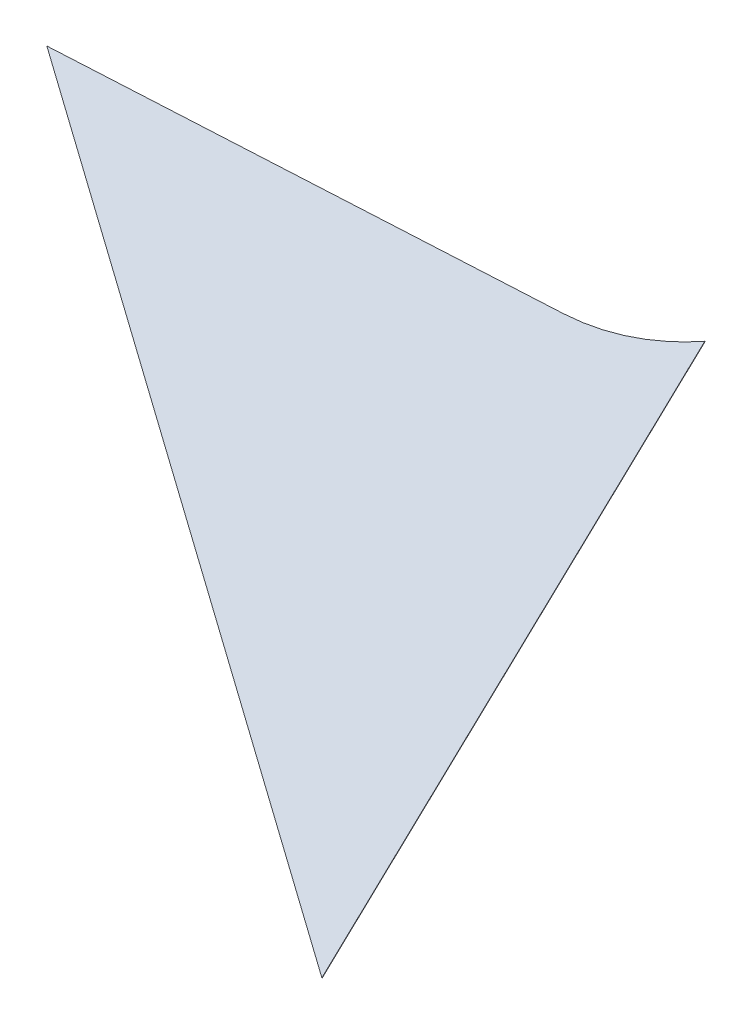
ISO-10303-21;
HEADER;
FILE_DESCRIPTION(('STEP AP214'),'2;1');
FILE_NAME('part.step','',(''),(''),'','','');
FILE_SCHEMA(('AUTOMOTIVE_DESIGN { 1 0 10303 214 1 1 1 1 }'));
ENDSEC;
DATA;
#1=APPLICATION_CONTEXT('core data for automotive mechanical design processes');
#2=APPLICATION_PROTOCOL_DEFINITION('international standard','automotive_design',2000,#1);
#3=PRODUCT_CONTEXT('',#1,'mechanical');
#4=PRODUCT('Part','Part','',(#3));
#5=PRODUCT_RELATED_PRODUCT_CATEGORY('part','',(#4));
#6=PRODUCT_DEFINITION_FORMATION('','',#4);
#7=PRODUCT_DEFINITION_CONTEXT('part definition',#1,'design');
#8=PRODUCT_DEFINITION('design','',#6,#7);
#9=PRODUCT_DEFINITION_SHAPE('','',#8);
#10=(LENGTH_UNIT() NAMED_UNIT(*) SI_UNIT(.MILLI.,.METRE.));
#11=(NAMED_UNIT(*) PLANE_ANGLE_UNIT() SI_UNIT($,.RADIAN.));
#12=(NAMED_UNIT(*) SI_UNIT($,.STERADIAN.) SOLID_ANGLE_UNIT());
#13=UNCERTAINTY_MEASURE_WITH_UNIT(LENGTH_MEASURE(1.E-05),#10,'distance_accuracy_value','');
#14=(GEOMETRIC_REPRESENTATION_CONTEXT(3) GLOBAL_UNCERTAINTY_ASSIGNED_CONTEXT((#13)) GLOBAL_UNIT_ASSIGNED_CONTEXT((#10,
#11,#12)) REPRESENTATION_CONTEXT('',''));
#15=CARTESIAN_POINT('',(0.,0.,0.));
#16=DIRECTION('',(0.,0.,1.));
#17=DIRECTION('',(1.,0.,0.));
#18=AXIS2_PLACEMENT_3D('',#15,#16,#17);
#19=CARTESIAN_POINT('',(134.379706623874,-456.493751062138,-494.623432295176));
#20=DIRECTION('',(0.587043551205633,0.547019488221211,-0.59678266437128));
#21=DIRECTION('',(-0.712899889949059,0.,-0.70126581758319));
#22=AXIS2_PLACEMENT_3D('',#19,#20,#21);
#23=PLANE('',#22);
#24=DIRECTION('',(-0.808314503040742,0.355259998294578,-0.469486951667173));
#25=VECTOR('',#24,1.);
#26=CARTESIAN_POINT('',(134.37287826511,-456.378232262931,-494.524263043155));
#27=LINE('',#26,#25);
#28=CARTESIAN_POINT('',(134.37287826511,-456.378232262931,-494.524263043155));
#29=VERTEX_POINT('',#28);
#30=CARTESIAN_POINT('',(-64.7492373711588,-368.862640008628,-610.178794451307));
#31=VERTEX_POINT('',#30);
#32=EDGE_CURVE('E115',#29,#31,#27,.T.);
#33=ORIENTED_EDGE('',*,*,#32,.T.);
#34=DIRECTION('',(-0.0448055037007385,0.757997370126006,0.650716876775285));
#35=VECTOR('',#34,1.);
#36=CARTESIAN_POINT('',(-64.7424090123948,-368.978158807835,-610.277963703327));
#37=LINE('',#36,#35);
#38=CARTESIAN_POINT('',(-64.7424090123948,-368.978158807835,-610.277963703327));
#39=VERTEX_POINT('',#38);
#40=EDGE_CURVE('E11',#39,#31,#37,.T.);
#41=ORIENTED_EDGE('',*,*,#40,.F.);
#42=DIRECTION('',(-0.808314503040742,0.355259998294578,-0.469486951667173));
#43=VECTOR('',#42,1.);
#44=CARTESIAN_POINT('',(134.379706623874,-456.493751062138,-494.623432295176));
#45=LINE('',#44,#43);
#46=CARTESIAN_POINT('',(134.379706623874,-456.493751062138,-494.623432295176));
#47=VERTEX_POINT('',#46);
#48=EDGE_CURVE('E88',#47,#39,#45,.T.);
#49=ORIENTED_EDGE('',*,*,#48,.F.);
#50=DIRECTION('',(-0.0448055037007385,0.757997370126006,0.650716876775285));
#51=VECTOR('',#50,1.);
#52=CARTESIAN_POINT('',(134.379706623874,-456.493751062138,-494.623432295176));
#53=LINE('',#52,#51);
#54=EDGE_CURVE('E96',#47,#29,#53,.T.);
#55=ORIENTED_EDGE('',*,*,#54,.T.);
#56=EDGE_LOOP('',(#33,#41,#49,#55));
#57=FACE_BOUND('',#56,.T.);
#58=ADVANCED_FACE('F37',(#57),#23,.F.);
#59=CARTESIAN_POINT('',(-64.7424090123948,-368.978158807835,-610.277963703327));
#60=DIRECTION('',(0.0326984589601948,-0.649909262510117,0.759308080613649));
#61=DIRECTION('',(0.,-0.759714328416125,-0.650256979354498));
#62=AXIS2_PLACEMENT_3D('',#59,#60,#61);
#63=PLANE('',#62);
#64=DIRECTION('',(0.998460453708484,0.0552986201058783,0.00433416596754045));
#65=VECTOR('',#64,1.);
#66=CARTESIAN_POINT('',(-64.7492373711588,-368.862640008628,-610.178794451307));
#67=LINE('',#66,#65);
#68=CARTESIAN_POINT('',(92.6239629562943,-360.146700596675,-609.49566116693));
#69=VERTEX_POINT('',#68);
#70=EDGE_CURVE('E92',#31,#69,#67,.T.);
#71=ORIENTED_EDGE('',*,*,#70,.T.);
#72=DIRECTION('',(-0.0448055037007385,0.757997370126006,0.650716876775285));
#73=VECTOR('',#72,1.);
#74=CARTESIAN_POINT('',(92.6307913150583,-360.262219395882,-609.594830418951));
#75=LINE('',#74,#73);
#76=CARTESIAN_POINT('',(92.6307913150583,-360.262219395882,-609.594830418951));
#77=VERTEX_POINT('',#76);
#78=EDGE_CURVE('E45',#77,#69,#75,.T.);
#79=ORIENTED_EDGE('',*,*,#78,.F.);
#80=DIRECTION('',(0.998460453708484,0.0552986201058783,0.00433416596754045));
#81=VECTOR('',#80,1.);
#82=CARTESIAN_POINT('',(-64.7424090123948,-368.978158807835,-610.277963703327));
#83=LINE('',#82,#81);
#84=EDGE_CURVE('E83',#39,#77,#83,.T.);
#85=ORIENTED_EDGE('',*,*,#84,.F.);
#86=ORIENTED_EDGE('',*,*,#40,.T.);
#87=EDGE_LOOP('',(#71,#79,#85,#86));
#88=FACE_BOUND('',#87,.T.);
#89=ADVANCED_FACE('F91',(#88),#63,.F.);
#90=CARTESIAN_POINT('',(89.9496234093832,-306.971761323701,-671.855637839248));
#91=DIRECTION('',(-0.0448055037007385,0.757997370126006,0.650716876775285));
#92=DIRECTION('',(0.998460453708482,0.0552986201059251,0.00433416596748591));
#93=AXIS2_PLACEMENT_3D('',#90,#91,#92);
#94=ELLIPSE('',#93,82.,81.9967665430088);
#95=DIRECTION('',(-0.0448055037007385,0.757997370126006,0.650716876775285));
#96=VECTOR('',#95,1.);
#97=SURFACE_OF_LINEAR_EXTRUSION('',#94,#96);
#98=CARTESIAN_POINT('',(89.9427950506192,-306.856242524494,-671.756468587228));
#99=DIRECTION('',(-0.0448055037007385,0.757997370126006,0.650716876775285));
#100=DIRECTION('',(0.998460453708482,0.0552986201059251,0.00433416596748591));
#101=AXIS2_PLACEMENT_3D('',#98,#99,#100);
#102=ELLIPSE('',#101,82.,81.9967665430088);
#103=CARTESIAN_POINT('',(129.142514062463,-352.42036239086,-615.981295879362));
#104=VERTEX_POINT('',#103);
#105=EDGE_CURVE('E70',#69,#104,#102,.T.);
#106=ORIENTED_EDGE('',*,*,#105,.T.);
#107=DIRECTION('',(-0.0448055037007385,0.757997370126006,0.650716876775285));
#108=VECTOR('',#107,1.);
#109=CARTESIAN_POINT('',(129.149342421227,-352.535881190067,-616.080465131383));
#110=LINE('',#109,#108);
#111=CARTESIAN_POINT('',(129.149342421227,-352.535881190067,-616.080465131383));
#112=VERTEX_POINT('',#111);
#113=EDGE_CURVE('E93',#112,#104,#110,.T.);
#114=ORIENTED_EDGE('',*,*,#113,.F.);
#115=EDGE_CURVE('E86',#77,#112,#94,.T.);
#116=ORIENTED_EDGE('',*,*,#115,.F.);
#117=ORIENTED_EDGE('',*,*,#78,.T.);
#118=EDGE_LOOP('',(#106,#114,#116,#117));
#119=FACE_BOUND('',#118,.T.);
#120=ADVANCED_FACE('F94',(#119),#97,.F.);
#121=CARTESIAN_POINT('',(129.149342421227,-352.535881190067,-616.080465131383));
#122=DIRECTION('',(-0.998460453708484,-0.0552986201058783,-0.00433416596754055));
#123=DIRECTION('',(0.055299139505337,-0.998469831877744,0.));
#124=AXIS2_PLACEMENT_3D('',#121,#122,#123);
#125=PLANE('',#124);
#126=DIRECTION('',(0.0326984589601948,-0.649909262510117,0.759308080613649));
#127=VECTOR('',#126,1.);
#128=CARTESIAN_POINT('',(129.142514062463,-352.42036239086,-615.981295879362));
#129=LINE('',#128,#127);
#130=EDGE_CURVE('E76',#104,#29,#129,.T.);
#131=ORIENTED_EDGE('',*,*,#130,.T.);
#132=ORIENTED_EDGE('',*,*,#54,.F.);
#133=DIRECTION('',(0.0326984589601948,-0.649909262510117,0.759308080613649));
#134=VECTOR('',#133,1.);
#135=CARTESIAN_POINT('',(129.149342421227,-352.535881190067,-616.080465131383));
#136=LINE('',#135,#134);
#137=EDGE_CURVE('E53',#112,#47,#136,.T.);
#138=ORIENTED_EDGE('',*,*,#137,.F.);
#139=ORIENTED_EDGE('',*,*,#113,.T.);
#140=EDGE_LOOP('',(#131,#132,#138,#139));
#141=FACE_BOUND('',#140,.T.);
#142=ADVANCED_FACE('F104',(#141),#125,.F.);
#143=CARTESIAN_POINT('',(89.9496234093832,-306.971761323701,-671.855637839248));
#144=DIRECTION('',(0.0448055037007385,-0.757997370126006,-0.650716876775285));
#145=DIRECTION('',(0.,0.65137102972008,-0.758759370051798));
#146=AXIS2_PLACEMENT_3D('',#143,#144,#145);
#147=PLANE('',#146);
#148=ORIENTED_EDGE('',*,*,#48,.T.);
#149=ORIENTED_EDGE('',*,*,#84,.T.);
#150=ORIENTED_EDGE('',*,*,#115,.T.);
#151=ORIENTED_EDGE('',*,*,#137,.T.);
#152=EDGE_LOOP('',(#148,#149,#150,#151));
#153=FACE_BOUND('',#152,.T.);
#154=ADVANCED_FACE('F84',(#153),#147,.T.);
#155=CARTESIAN_POINT('',(89.9427950506192,-306.856242524494,-671.756468587228));
#156=DIRECTION('',(0.0448055037007385,-0.757997370126006,-0.650716876775285));
#157=DIRECTION('',(0.,0.65137102972008,-0.758759370051798));
#158=AXIS2_PLACEMENT_3D('',#155,#156,#157);
#159=PLANE('',#158);
#160=ORIENTED_EDGE('',*,*,#32,.F.);
#161=ORIENTED_EDGE('',*,*,#130,.F.);
#162=ORIENTED_EDGE('',*,*,#105,.F.);
#163=ORIENTED_EDGE('',*,*,#70,.F.);
#164=EDGE_LOOP('',(#160,#161,#162,#163));
#165=FACE_BOUND('',#164,.T.);
#166=ADVANCED_FACE('F122',(#165),#159,.F.);
#167=CLOSED_SHELL('',(#58,#89,#120,#142,#154,#166));
#168=MANIFOLD_SOLID_BREP('B2',#167);
#169=ADVANCED_BREP_SHAPE_REPRESENTATION('',(#18,#168),#14);
#170=SHAPE_DEFINITION_REPRESENTATION(#9,#169);
ENDSEC;
END-ISO-10303-21;
